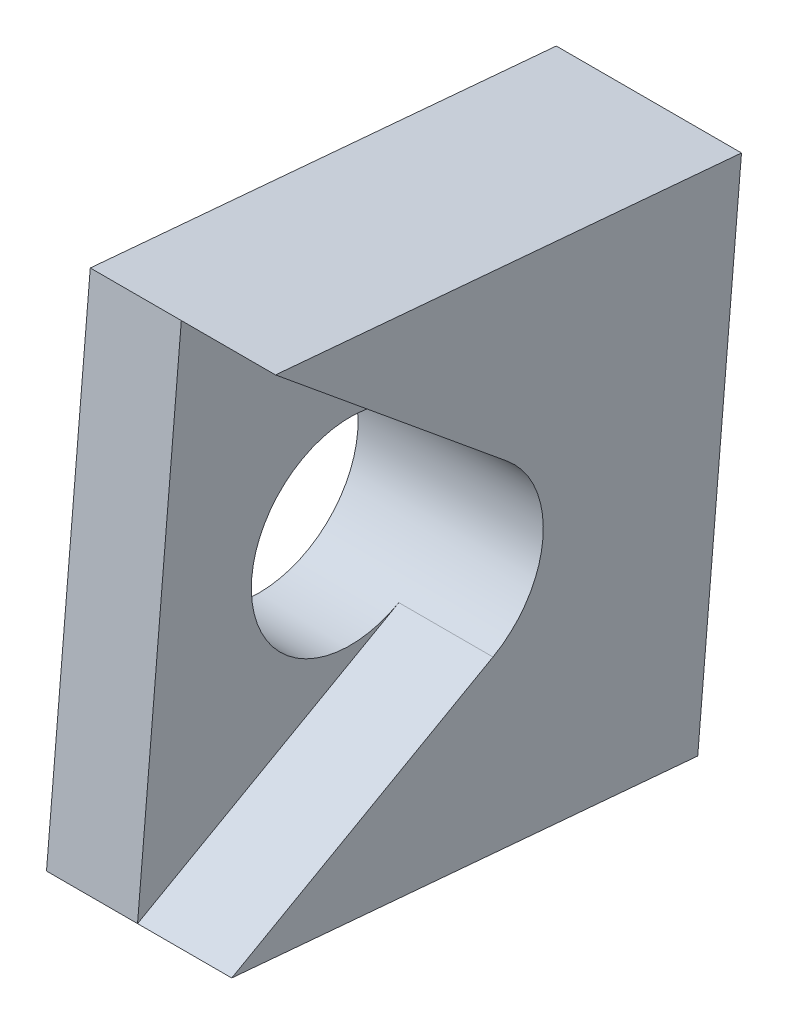
ISO-10303-21;
HEADER;
FILE_DESCRIPTION(('STEP AP214'),'2;1');
FILE_NAME('part.step','',(''),(''),'','','');
FILE_SCHEMA(('AUTOMOTIVE_DESIGN { 1 0 10303 214 1 1 1 1 }'));
ENDSEC;
DATA;
#1=APPLICATION_CONTEXT('core data for automotive mechanical design processes');
#2=APPLICATION_PROTOCOL_DEFINITION('international standard','automotive_design',2000,#1);
#3=PRODUCT_CONTEXT('',#1,'mechanical');
#4=PRODUCT('Part','Part','',(#3));
#5=PRODUCT_RELATED_PRODUCT_CATEGORY('part','',(#4));
#6=PRODUCT_DEFINITION_FORMATION('','',#4);
#7=PRODUCT_DEFINITION_CONTEXT('part definition',#1,'design');
#8=PRODUCT_DEFINITION('design','',#6,#7);
#9=PRODUCT_DEFINITION_SHAPE('','',#8);
#10=(LENGTH_UNIT() NAMED_UNIT(*) SI_UNIT(.MILLI.,.METRE.));
#11=(NAMED_UNIT(*) PLANE_ANGLE_UNIT() SI_UNIT($,.RADIAN.));
#12=(NAMED_UNIT(*) SI_UNIT($,.STERADIAN.) SOLID_ANGLE_UNIT());
#13=UNCERTAINTY_MEASURE_WITH_UNIT(LENGTH_MEASURE(1.E-05),#10,'distance_accuracy_value','');
#14=(GEOMETRIC_REPRESENTATION_CONTEXT(3) GLOBAL_UNCERTAINTY_ASSIGNED_CONTEXT((#13)) GLOBAL_UNIT_ASSIGNED_CONTEXT((#10,
#11,#12)) REPRESENTATION_CONTEXT('',''));
#15=CARTESIAN_POINT('',(0.,0.,0.));
#16=DIRECTION('',(0.,0.,1.));
#17=DIRECTION('',(1.,0.,0.));
#18=AXIS2_PLACEMENT_3D('',#15,#16,#17);
#19=CARTESIAN_POINT('',(14.,-52.2127503886378,-21.4354866235499));
#20=DIRECTION('',(-1.,0.,0.));
#21=DIRECTION('',(0.,-1.,0.));
#22=AXIS2_PLACEMENT_3D('',#19,#20,#21);
#23=PLANE('',#22);
#24=CARTESIAN_POINT('',(14.,-57.9290572909012,5.01653247030481));
#25=DIRECTION('',(-1.,0.,0.));
#26=DIRECTION('',(0.,-1.,0.));
#27=AXIS2_PLACEMENT_3D('',#24,#25,#26);
#28=CIRCLE('',#27,3.15000000000078);
#29=CARTESIAN_POINT('',(14.,-61.079057290902,5.01653247030481));
#30=VERTEX_POINT('',#29);
#31=EDGE_CURVE('E129',#30,#30,#28,.T.);
#32=ORIENTED_EDGE('',*,*,#31,.F.);
#33=EDGE_LOOP('',(#32));
#34=FACE_BOUND('',#33,.T.);
#35=DIRECTION('',(0.,0.996194698091746,-0.0871557427476508));
#36=VECTOR('',#35,1.);
#37=CARTESIAN_POINT('',(14.,-50.7264702423465,-4.44722681488376));
#38=LINE('',#37,#36);
#39=CARTESIAN_POINT('',(14.,-66.6655854118145,-3.05273493092135));
#40=VERTEX_POINT('',#39);
#41=CARTESIAN_POINT('',(14.,-50.7264702423465,-4.44722681488376));
#42=VERTEX_POINT('',#41);
#43=EDGE_CURVE('E137',#40,#42,#38,.T.);
#44=ORIENTED_EDGE('',*,*,#43,.F.);
#45=DIRECTION('',(0.,0.0871557427476508,0.996194698091746));
#46=VECTOR('',#45,1.);
#47=CARTESIAN_POINT('',(14.,-68.1518655581057,-20.0409947395875));
#48=LINE('',#47,#46);
#49=CARTESIAN_POINT('',(14.,-65.3669648448745,11.7905660706457));
#50=VERTEX_POINT('',#49);
#51=EDGE_CURVE('E146',#40,#50,#48,.T.);
#52=ORIENTED_EDGE('',*,*,#51,.T.);
#53=DIRECTION('',(0.,-0.996194698091746,0.0871557427476508));
#54=VECTOR('',#53,1.);
#55=CARTESIAN_POINT('',(14.,-49.4278496754065,10.3960741866833));
#56=LINE('',#55,#54);
#57=CARTESIAN_POINT('',(14.,-49.4278496754065,10.3960741866833));
#58=VERTEX_POINT('',#57);
#59=EDGE_CURVE('E132',#58,#50,#56,.T.);
#60=ORIENTED_EDGE('',*,*,#59,.F.);
#61=DIRECTION('',(0.,0.0871557427476508,0.996194698091746));
#62=VECTOR('',#61,1.);
#63=CARTESIAN_POINT('',(14.,-52.2127503886378,-21.4354866235499));
#64=LINE('',#63,#62);
#65=EDGE_CURVE('E135',#42,#58,#64,.T.);
#66=ORIENTED_EDGE('',*,*,#65,.F.);
#67=EDGE_LOOP('',(#44,#52,#60,#66));
#68=FACE_BOUND('',#67,.T.);
#69=ADVANCED_FACE('F41',(#34,#68),#23,.T.);
#70=CARTESIAN_POINT('',(14.,-52.2127503886378,-21.4354866235499));
#71=DIRECTION('',(0.,0.996194698091746,-0.0871557427476508));
#72=DIRECTION('',(0.,0.0871557427476508,0.996194698091746));
#73=AXIS2_PLACEMENT_3D('',#70,#71,#72);
#74=PLANE('',#73);
#75=DIRECTION('',(1.,0.,0.));
#76=VECTOR('',#75,1.);
#77=CARTESIAN_POINT('',(14.,-50.7264702423465,-4.44722681488376));
#78=LINE('',#77,#76);
#79=CARTESIAN_POINT('',(19.9,-50.7264702423465,-4.44722681488376));
#80=VERTEX_POINT('',#79);
#81=EDGE_CURVE('E64',#42,#80,#78,.T.);
#82=ORIENTED_EDGE('',*,*,#81,.F.);
#83=ORIENTED_EDGE('',*,*,#65,.T.);
#84=DIRECTION('',(-1.,0.,0.));
#85=VECTOR('',#84,1.);
#86=CARTESIAN_POINT('',(14.,-49.4278496754065,10.3960741866833));
#87=LINE('',#86,#85);
#88=CARTESIAN_POINT('',(16.9,-49.4278496754065,10.3960741866833));
#89=VERTEX_POINT('',#88);
#90=EDGE_CURVE('E144',#89,#58,#87,.T.);
#91=ORIENTED_EDGE('',*,*,#90,.F.);
#92=CARTESIAN_POINT('',(19.9,-49.4278496754065,10.3960741866833));
#93=VERTEX_POINT('',#92);
#94=EDGE_CURVE('E111',#93,#89,#87,.T.);
#95=ORIENTED_EDGE('',*,*,#94,.F.);
#96=DIRECTION('',(0.,0.0871557427476508,0.996194698091746));
#97=VECTOR('',#96,1.);
#98=CARTESIAN_POINT('',(19.9,-52.2127503886378,-21.4354866235499));
#99=LINE('',#98,#97);
#100=EDGE_CURVE('E149',#80,#93,#99,.T.);
#101=ORIENTED_EDGE('',*,*,#100,.F.);
#102=EDGE_LOOP('',(#82,#83,#91,#95,#101));
#103=FACE_BOUND('',#102,.T.);
#104=ADVANCED_FACE('F171',(#103),#74,.T.);
#105=CARTESIAN_POINT('',(19.9,-52.2127503886378,-21.4354866235499));
#106=DIRECTION('',(1.,0.,0.));
#107=DIRECTION('',(0.,0.,-1.));
#108=AXIS2_PLACEMENT_3D('',#105,#106,#107);
#109=PLANE('',#108);
#110=DIRECTION('',(0.,0.63510325175276,0.772427251987571));
#111=VECTOR('',#110,1.);
#112=CARTESIAN_POINT('',(19.9,-47.8879083203249,12.2689864507048));
#113=LINE('',#112,#111);
#114=CARTESIAN_POINT('',(19.9,-55.4959114471397,3.01595722728313));
#115=VERTEX_POINT('',#114);
#116=EDGE_CURVE('E124',#115,#93,#113,.T.);
#117=ORIENTED_EDGE('',*,*,#116,.F.);
#118=CARTESIAN_POINT('',(19.9,-57.9290572909012,5.01653247030481));
#119=DIRECTION('',(1.,0.,0.));
#120=DIRECTION('',(0.,1.,0.));
#121=AXIS2_PLACEMENT_3D('',#118,#119,#120);
#122=CIRCLE('',#121,3.15000000000078);
#123=CARTESIAN_POINT('',(19.9,-60.6726344272831,3.46886180225977));
#124=VERTEX_POINT('',#123);
#125=EDGE_CURVE('E117',#124,#115,#122,.T.);
#126=ORIENTED_EDGE('',*,*,#125,.F.);
#127=DIRECTION('',(0.,0.491324021601473,-0.870976868692478));
#128=VECTOR('',#127,1.);
#129=CARTESIAN_POINT('',(19.9,-60.6726344272831,3.46886180225977));
#130=LINE('',#129,#128);
#131=CARTESIAN_POINT('',(19.9,-65.3669648448744,11.7905660706457));
#132=VERTEX_POINT('',#131);
#133=EDGE_CURVE('E176',#132,#124,#130,.T.);
#134=ORIENTED_EDGE('',*,*,#133,.F.);
#135=DIRECTION('',(0.,0.0871557427476508,0.996194698091746));
#136=VECTOR('',#135,1.);
#137=CARTESIAN_POINT('',(19.9,-68.1518655581057,-20.0409947395875));
#138=LINE('',#137,#136);
#139=CARTESIAN_POINT('',(19.9,-66.6655854118145,-3.05273493092135));
#140=VERTEX_POINT('',#139);
#141=EDGE_CURVE('E152',#140,#132,#138,.T.);
#142=ORIENTED_EDGE('',*,*,#141,.F.);
#143=DIRECTION('',(0.,-0.996194698091746,0.0871557427476508));
#144=VECTOR('',#143,1.);
#145=CARTESIAN_POINT('',(19.9,-50.7264702423465,-4.44722681488376));
#146=LINE('',#145,#144);
#147=EDGE_CURVE('E133',#80,#140,#146,.T.);
#148=ORIENTED_EDGE('',*,*,#147,.F.);
#149=ORIENTED_EDGE('',*,*,#100,.T.);
#150=EDGE_LOOP('',(#117,#126,#134,#142,#148,#149));
#151=FACE_BOUND('',#150,.T.);
#152=ADVANCED_FACE('F174',(#151),#109,.T.);
#153=CARTESIAN_POINT('',(14.,-68.1518655581057,-20.0409947395875));
#154=DIRECTION('',(0.,-0.996194698091746,0.0871557427476508));
#155=DIRECTION('',(0.,-0.0871557427476508,-0.996194698091746));
#156=AXIS2_PLACEMENT_3D('',#153,#154,#155);
#157=PLANE('',#156);
#158=DIRECTION('',(-1.,0.,0.));
#159=VECTOR('',#158,1.);
#160=CARTESIAN_POINT('',(14.,-66.6655854118145,-3.05273493092135));
#161=LINE('',#160,#159);
#162=EDGE_CURVE('E48',#140,#40,#161,.T.);
#163=ORIENTED_EDGE('',*,*,#162,.F.);
#164=ORIENTED_EDGE('',*,*,#141,.T.);
#165=DIRECTION('',(1.,0.,0.));
#166=VECTOR('',#165,1.);
#167=CARTESIAN_POINT('',(0.,-65.3669648448744,11.7905660706457));
#168=LINE('',#167,#166);
#169=CARTESIAN_POINT('',(16.9,-65.3669648448744,11.7905660706457));
#170=VERTEX_POINT('',#169);
#171=EDGE_CURVE('E120',#170,#132,#168,.T.);
#172=ORIENTED_EDGE('',*,*,#171,.F.);
#173=DIRECTION('',(1.,0.,0.));
#174=VECTOR('',#173,1.);
#175=CARTESIAN_POINT('',(14.,-65.3669648448745,11.7905660706457));
#176=LINE('',#175,#174);
#177=EDGE_CURVE('E141',#50,#170,#176,.T.);
#178=ORIENTED_EDGE('',*,*,#177,.F.);
#179=ORIENTED_EDGE('',*,*,#51,.F.);
#180=EDGE_LOOP('',(#163,#164,#172,#178,#179));
#181=FACE_BOUND('',#180,.T.);
#182=ADVANCED_FACE('F165',(#181),#157,.T.);
#183=CARTESIAN_POINT('',(0.,0.527169618531755,6.02557631224523));
#184=DIRECTION('',(0.,0.0871557427476508,0.996194698091746));
#185=DIRECTION('',(0.,-0.996194698091746,0.0871557427476508));
#186=AXIS2_PLACEMENT_3D('',#183,#184,#185);
#187=PLANE('',#186);
#188=DIRECTION('',(0.,-0.996194698091746,0.0871557427476508));
#189=VECTOR('',#188,1.);
#190=CARTESIAN_POINT('',(16.9,0.527169618531755,6.02557631224523));
#191=LINE('',#190,#189);
#192=EDGE_CURVE('E118',#89,#170,#191,.T.);
#193=ORIENTED_EDGE('',*,*,#192,.F.);
#194=ORIENTED_EDGE('',*,*,#90,.T.);
#195=ORIENTED_EDGE('',*,*,#59,.T.);
#196=ORIENTED_EDGE('',*,*,#177,.T.);
#197=EDGE_LOOP('',(#193,#194,#195,#196));
#198=FACE_BOUND('',#197,.T.);
#199=ADVANCED_FACE('F168',(#198),#187,.T.);
#200=CARTESIAN_POINT('',(0.,-0.771450948408242,-8.81772468932179));
#201=DIRECTION('',(0.,0.0871557427476508,0.996194698091746));
#202=DIRECTION('',(0.,-0.996194698091746,0.0871557427476508));
#203=AXIS2_PLACEMENT_3D('',#200,#201,#202);
#204=PLANE('',#203);
#205=ORIENTED_EDGE('',*,*,#43,.T.);
#206=ORIENTED_EDGE('',*,*,#81,.T.);
#207=ORIENTED_EDGE('',*,*,#147,.T.);
#208=ORIENTED_EDGE('',*,*,#162,.T.);
#209=EDGE_LOOP('',(#205,#206,#207,#208));
#210=FACE_BOUND('',#209,.T.);
#211=ADVANCED_FACE('F157',(#210),#204,.F.);
#212=CARTESIAN_POINT('',(-16.1311755165637,-57.9290572909012,5.01653247030481));
#213=DIRECTION('',(1.,0.,0.));
#214=DIRECTION('',(0.,1.,0.));
#215=AXIS2_PLACEMENT_3D('',#212,#213,#214);
#216=CYLINDRICAL_SURFACE('',#215,3.15000000000078);
#217=CARTESIAN_POINT('',(16.9,-57.9290572909012,5.01653247030481));
#218=DIRECTION('',(-1.,0.,0.));
#219=DIRECTION('',(0.,0.,1.));
#220=AXIS2_PLACEMENT_3D('',#217,#218,#219);
#221=CIRCLE('',#220,3.15000000000078);
#222=CARTESIAN_POINT('',(16.9,-55.4959114471397,3.01595722728313));
#223=VERTEX_POINT('',#222);
#224=CARTESIAN_POINT('',(16.9,-60.6726344272832,3.46886180225979));
#225=VERTEX_POINT('',#224);
#226=EDGE_CURVE('E12',#223,#225,#221,.F.);
#227=ORIENTED_EDGE('',*,*,#226,.T.);
#228=DIRECTION('',(1.,0.,0.));
#229=VECTOR('',#228,1.);
#230=CARTESIAN_POINT('',(16.9,-60.6726344272831,3.46886180225977));
#231=LINE('',#230,#229);
#232=EDGE_CURVE('E55',#225,#124,#231,.T.);
#233=ORIENTED_EDGE('',*,*,#232,.T.);
#234=ORIENTED_EDGE('',*,*,#125,.T.);
#235=DIRECTION('',(1.,0.,0.));
#236=VECTOR('',#235,1.);
#237=CARTESIAN_POINT('',(16.9,-55.4959114471397,3.01595722728313));
#238=LINE('',#237,#236);
#239=EDGE_CURVE('E108',#223,#115,#238,.T.);
#240=ORIENTED_EDGE('',*,*,#239,.F.);
#241=EDGE_LOOP('',(#227,#233,#234,#240));
#242=FACE_BOUND('',#241,.T.);
#243=ORIENTED_EDGE('',*,*,#31,.T.);
#244=EDGE_LOOP('',(#243));
#245=FACE_BOUND('',#244,.T.);
#246=ADVANCED_FACE('F114',(#242,#245),#216,.F.);
#247=CARTESIAN_POINT('',(16.9,-57.9290572909012,5.01653247030481));
#248=DIRECTION('',(-1.,0.,0.));
#249=DIRECTION('',(0.,0.,1.));
#250=AXIS2_PLACEMENT_3D('',#247,#248,#249);
#251=PLANE('',#250);
#252=ORIENTED_EDGE('',*,*,#192,.T.);
#253=DIRECTION('',(0.,0.491324021601473,-0.870976868692478));
#254=VECTOR('',#253,1.);
#255=CARTESIAN_POINT('',(16.9,-60.6726344272831,3.46886180225977));
#256=LINE('',#255,#254);
#257=EDGE_CURVE('E103',#170,#225,#256,.T.);
#258=ORIENTED_EDGE('',*,*,#257,.T.);
#259=ORIENTED_EDGE('',*,*,#226,.F.);
#260=DIRECTION('',(0.,0.63510325175276,0.772427251987571));
#261=VECTOR('',#260,1.);
#262=CARTESIAN_POINT('',(16.9,-47.8879083203249,12.2689864507048));
#263=LINE('',#262,#261);
#264=EDGE_CURVE('E101',#223,#89,#263,.T.);
#265=ORIENTED_EDGE('',*,*,#264,.T.);
#266=EDGE_LOOP('',(#252,#258,#259,#265));
#267=FACE_BOUND('',#266,.T.);
#268=ADVANCED_FACE('F100',(#267),#251,.F.);
#269=CARTESIAN_POINT('',(16.9,-47.8879083203249,12.2689864507048));
#270=DIRECTION('',(0.,0.772427251987571,-0.63510325175276));
#271=DIRECTION('',(0.,0.63510325175276,0.772427251987571));
#272=AXIS2_PLACEMENT_3D('',#269,#270,#271);
#273=PLANE('',#272);
#274=ORIENTED_EDGE('',*,*,#94,.T.);
#275=ORIENTED_EDGE('',*,*,#264,.F.);
#276=ORIENTED_EDGE('',*,*,#239,.T.);
#277=ORIENTED_EDGE('',*,*,#116,.T.);
#278=EDGE_LOOP('',(#274,#275,#276,#277));
#279=FACE_BOUND('',#278,.T.);
#280=ADVANCED_FACE('F107',(#279),#273,.F.);
#281=CARTESIAN_POINT('',(16.9,-60.6726344272831,3.46886180225977));
#282=DIRECTION('',(0.,-0.870976868692479,-0.491324021601473));
#283=DIRECTION('',(0.,0.491324021601473,-0.870976868692479));
#284=AXIS2_PLACEMENT_3D('',#281,#282,#283);
#285=PLANE('',#284);
#286=ORIENTED_EDGE('',*,*,#171,.T.);
#287=ORIENTED_EDGE('',*,*,#133,.T.);
#288=ORIENTED_EDGE('',*,*,#232,.F.);
#289=ORIENTED_EDGE('',*,*,#257,.F.);
#290=EDGE_LOOP('',(#286,#287,#288,#289));
#291=FACE_BOUND('',#290,.T.);
#292=ADVANCED_FACE('F178',(#291),#285,.F.);
#293=CLOSED_SHELL('',(#69,#104,#152,#182,#199,#211,#246,#268,#280,#292));
#294=MANIFOLD_SOLID_BREP('B2',#293);
#295=ADVANCED_BREP_SHAPE_REPRESENTATION('',(#18,#294),#14);
#296=SHAPE_DEFINITION_REPRESENTATION(#9,#295);
ENDSEC;
END-ISO-10303-21;
